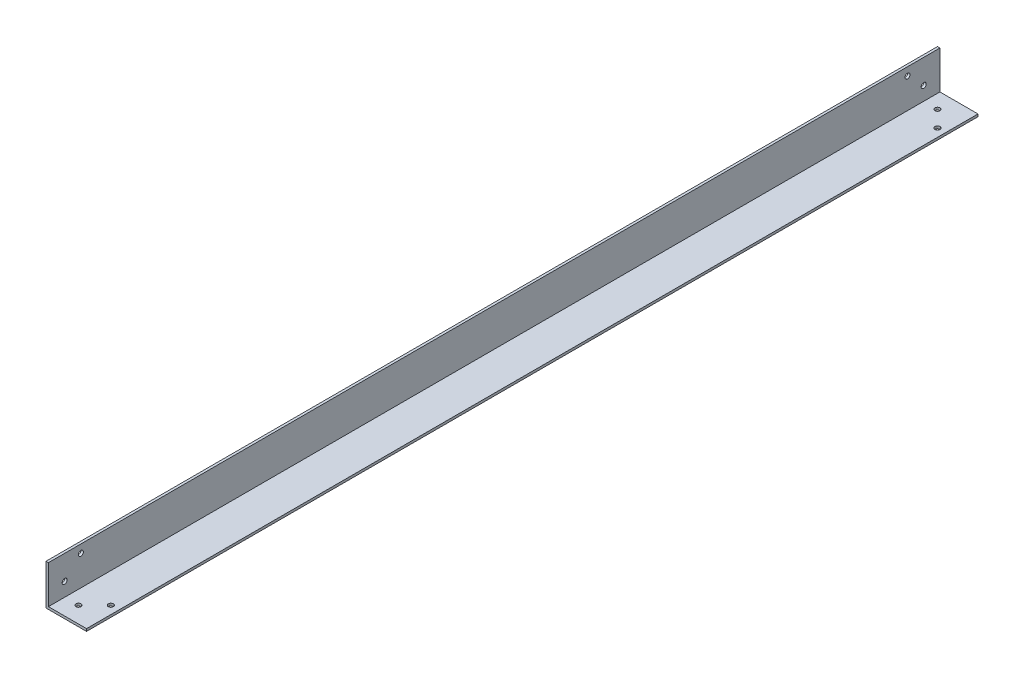
ISO-10303-21;
HEADER;
FILE_DESCRIPTION(('STEP AP214'),'2;1');
FILE_NAME('part.step','',(''),(''),'','','');
FILE_SCHEMA(('AUTOMOTIVE_DESIGN { 1 0 10303 214 1 1 1 1 }'));
ENDSEC;
DATA;
#1=APPLICATION_CONTEXT('core data for automotive mechanical design processes');
#2=APPLICATION_PROTOCOL_DEFINITION('international standard','automotive_design',2000,#1);
#3=PRODUCT_CONTEXT('',#1,'mechanical');
#4=PRODUCT('Part','Part','',(#3));
#5=PRODUCT_RELATED_PRODUCT_CATEGORY('part','',(#4));
#6=PRODUCT_DEFINITION_FORMATION('','',#4);
#7=PRODUCT_DEFINITION_CONTEXT('part definition',#1,'design');
#8=PRODUCT_DEFINITION('design','',#6,#7);
#9=PRODUCT_DEFINITION_SHAPE('','',#8);
#10=(LENGTH_UNIT() NAMED_UNIT(*) SI_UNIT(.MILLI.,.METRE.));
#11=(NAMED_UNIT(*) PLANE_ANGLE_UNIT() SI_UNIT($,.RADIAN.));
#12=(NAMED_UNIT(*) SI_UNIT($,.STERADIAN.) SOLID_ANGLE_UNIT());
#13=UNCERTAINTY_MEASURE_WITH_UNIT(LENGTH_MEASURE(1.E-05),#10,'distance_accuracy_value','');
#14=(GEOMETRIC_REPRESENTATION_CONTEXT(3) GLOBAL_UNCERTAINTY_ASSIGNED_CONTEXT((#13)) GLOBAL_UNIT_ASSIGNED_CONTEXT((#10,
#11,#12)) REPRESENTATION_CONTEXT('',''));
#15=CARTESIAN_POINT('',(0.,0.,0.));
#16=DIRECTION('',(0.,0.,1.));
#17=DIRECTION('',(1.,0.,0.));
#18=AXIS2_PLACEMENT_3D('',#15,#16,#17);
#19=CARTESIAN_POINT('',(25.,0.,550.));
#20=DIRECTION('',(0.,1.,0.));
#21=DIRECTION('',(-1.,0.,0.));
#22=AXIS2_PLACEMENT_3D('',#19,#20,#21);
#23=PLANE('',#22);
#24=CARTESIAN_POINT('',(10.,0.,10.));
#25=DIRECTION('',(0.,-1.,0.));
#26=DIRECTION('',(1.,0.,0.));
#27=AXIS2_PLACEMENT_3D('',#24,#25,#26);
#28=CIRCLE('',#27,1.55);
#29=CARTESIAN_POINT('',(11.55,0.,10.));
#30=VERTEX_POINT('',#29);
#31=EDGE_CURVE('E156',#30,#30,#28,.T.);
#32=ORIENTED_EDGE('',*,*,#31,.F.);
#33=EDGE_LOOP('',(#32));
#34=FACE_BOUND('',#33,.T.);
#35=CARTESIAN_POINT('',(20.0000000000001,0.,20.));
#36=DIRECTION('',(0.,-1.,0.));
#37=DIRECTION('',(1.,0.,0.));
#38=AXIS2_PLACEMENT_3D('',#35,#36,#37);
#39=CIRCLE('',#38,1.55);
#40=CARTESIAN_POINT('',(21.5500000000001,0.,20.));
#41=VERTEX_POINT('',#40);
#42=EDGE_CURVE('E146',#41,#41,#39,.T.);
#43=ORIENTED_EDGE('',*,*,#42,.F.);
#44=EDGE_LOOP('',(#43));
#45=FACE_BOUND('',#44,.T.);
#46=CARTESIAN_POINT('',(20.,0.,530.));
#47=DIRECTION('',(0.,-1.,0.));
#48=DIRECTION('',(1.,0.,0.));
#49=AXIS2_PLACEMENT_3D('',#46,#47,#48);
#50=CIRCLE('',#49,1.54999999999998);
#51=CARTESIAN_POINT('',(21.55,0.,530.));
#52=VERTEX_POINT('',#51);
#53=EDGE_CURVE('E143',#52,#52,#50,.T.);
#54=ORIENTED_EDGE('',*,*,#53,.F.);
#55=EDGE_LOOP('',(#54));
#56=FACE_BOUND('',#55,.T.);
#57=CARTESIAN_POINT('',(10.,0.,540.));
#58=DIRECTION('',(0.,-1.,0.));
#59=DIRECTION('',(1.,0.,0.));
#60=AXIS2_PLACEMENT_3D('',#57,#58,#59);
#61=CIRCLE('',#60,1.54999999999997);
#62=CARTESIAN_POINT('',(11.55,0.,540.));
#63=VERTEX_POINT('',#62);
#64=EDGE_CURVE('E140',#63,#63,#61,.T.);
#65=ORIENTED_EDGE('',*,*,#64,.F.);
#66=EDGE_LOOP('',(#65));
#67=FACE_BOUND('',#66,.T.);
#68=DIRECTION('',(1.,0.,0.));
#69=VECTOR('',#68,1.);
#70=CARTESIAN_POINT('',(25.,0.,0.));
#71=LINE('',#70,#69);
#72=CARTESIAN_POINT('',(0.,0.,0.));
#73=VERTEX_POINT('',#72);
#74=CARTESIAN_POINT('',(25.,0.,0.));
#75=VERTEX_POINT('',#74);
#76=EDGE_CURVE('E119',#73,#75,#71,.T.);
#77=ORIENTED_EDGE('',*,*,#76,.T.);
#78=DIRECTION('',(0.,0.,-1.));
#79=VECTOR('',#78,1.);
#80=CARTESIAN_POINT('',(25.,0.,550.));
#81=LINE('',#80,#79);
#82=CARTESIAN_POINT('',(25.,0.,550.));
#83=VERTEX_POINT('',#82);
#84=EDGE_CURVE('E11',#83,#75,#81,.T.);
#85=ORIENTED_EDGE('',*,*,#84,.F.);
#86=DIRECTION('',(1.,0.,0.));
#87=VECTOR('',#86,1.);
#88=CARTESIAN_POINT('',(25.,0.,550.));
#89=LINE('',#88,#87);
#90=CARTESIAN_POINT('',(0.,0.,550.));
#91=VERTEX_POINT('',#90);
#92=EDGE_CURVE('E130',#91,#83,#89,.T.);
#93=ORIENTED_EDGE('',*,*,#92,.F.);
#94=DIRECTION('',(0.,0.,-1.));
#95=VECTOR('',#94,1.);
#96=CARTESIAN_POINT('',(0.,0.,550.));
#97=LINE('',#96,#95);
#98=EDGE_CURVE('E115',#91,#73,#97,.T.);
#99=ORIENTED_EDGE('',*,*,#98,.T.);
#100=EDGE_LOOP('',(#77,#85,#93,#99));
#101=FACE_BOUND('',#100,.T.);
#102=ADVANCED_FACE('F33',(#34,#45,#56,#67,#101),#23,.F.);
#103=CARTESIAN_POINT('',(25.,1.5,550.));
#104=DIRECTION('',(-1.,0.,0.));
#105=DIRECTION('',(0.,0.,1.));
#106=AXIS2_PLACEMENT_3D('',#103,#104,#105);
#107=PLANE('',#106);
#108=DIRECTION('',(0.,1.,0.));
#109=VECTOR('',#108,1.);
#110=CARTESIAN_POINT('',(25.,1.5,0.));
#111=LINE('',#110,#109);
#112=CARTESIAN_POINT('',(25.,1.5,0.));
#113=VERTEX_POINT('',#112);
#114=EDGE_CURVE('E122',#75,#113,#111,.T.);
#115=ORIENTED_EDGE('',*,*,#114,.T.);
#116=DIRECTION('',(0.,0.,-1.));
#117=VECTOR('',#116,1.);
#118=CARTESIAN_POINT('',(25.,1.5,550.));
#119=LINE('',#118,#117);
#120=CARTESIAN_POINT('',(25.,1.5,550.));
#121=VERTEX_POINT('',#120);
#122=EDGE_CURVE('E42',#121,#113,#119,.T.);
#123=ORIENTED_EDGE('',*,*,#122,.F.);
#124=DIRECTION('',(0.,1.,0.));
#125=VECTOR('',#124,1.);
#126=CARTESIAN_POINT('',(25.,1.5,550.));
#127=LINE('',#126,#125);
#128=EDGE_CURVE('E88',#83,#121,#127,.T.);
#129=ORIENTED_EDGE('',*,*,#128,.F.);
#130=ORIENTED_EDGE('',*,*,#84,.T.);
#131=EDGE_LOOP('',(#115,#123,#129,#130));
#132=FACE_BOUND('',#131,.T.);
#133=ADVANCED_FACE('F186',(#132),#107,.F.);
#134=CARTESIAN_POINT('',(1.5,1.5,550.));
#135=DIRECTION('',(0.,-1.,0.));
#136=DIRECTION('',(1.,0.,0.));
#137=AXIS2_PLACEMENT_3D('',#134,#135,#136);
#138=PLANE('',#137);
#139=CARTESIAN_POINT('',(10.,1.5,10.));
#140=DIRECTION('',(0.,-1.,0.));
#141=DIRECTION('',(1.,0.,0.));
#142=AXIS2_PLACEMENT_3D('',#139,#140,#141);
#143=CIRCLE('',#142,1.55);
#144=CARTESIAN_POINT('',(11.55,1.5,10.));
#145=VERTEX_POINT('',#144);
#146=EDGE_CURVE('E36',#145,#145,#143,.T.);
#147=ORIENTED_EDGE('',*,*,#146,.T.);
#148=EDGE_LOOP('',(#147));
#149=FACE_BOUND('',#148,.T.);
#150=CARTESIAN_POINT('',(20.0000000000001,1.5,20.));
#151=DIRECTION('',(0.,-1.,0.));
#152=DIRECTION('',(1.,0.,0.));
#153=AXIS2_PLACEMENT_3D('',#150,#151,#152);
#154=CIRCLE('',#153,1.55);
#155=CARTESIAN_POINT('',(21.5500000000001,1.5,20.));
#156=VERTEX_POINT('',#155);
#157=EDGE_CURVE('E144',#156,#156,#154,.T.);
#158=ORIENTED_EDGE('',*,*,#157,.T.);
#159=EDGE_LOOP('',(#158));
#160=FACE_BOUND('',#159,.T.);
#161=CARTESIAN_POINT('',(20.,1.5,530.));
#162=DIRECTION('',(0.,-1.,0.));
#163=DIRECTION('',(1.,0.,0.));
#164=AXIS2_PLACEMENT_3D('',#161,#162,#163);
#165=CIRCLE('',#164,1.54999999999998);
#166=CARTESIAN_POINT('',(21.55,1.5,530.));
#167=VERTEX_POINT('',#166);
#168=EDGE_CURVE('E141',#167,#167,#165,.T.);
#169=ORIENTED_EDGE('',*,*,#168,.T.);
#170=EDGE_LOOP('',(#169));
#171=FACE_BOUND('',#170,.T.);
#172=CARTESIAN_POINT('',(10.,1.5,540.));
#173=DIRECTION('',(0.,-1.,0.));
#174=DIRECTION('',(1.,0.,0.));
#175=AXIS2_PLACEMENT_3D('',#172,#173,#174);
#176=CIRCLE('',#175,1.54999999999997);
#177=CARTESIAN_POINT('',(11.55,1.5,540.));
#178=VERTEX_POINT('',#177);
#179=EDGE_CURVE('E136',#178,#178,#176,.T.);
#180=ORIENTED_EDGE('',*,*,#179,.T.);
#181=EDGE_LOOP('',(#180));
#182=FACE_BOUND('',#181,.T.);
#183=DIRECTION('',(-1.,0.,0.));
#184=VECTOR('',#183,1.);
#185=CARTESIAN_POINT('',(1.5,1.5,0.));
#186=LINE('',#185,#184);
#187=CARTESIAN_POINT('',(1.5,1.5,0.));
#188=VERTEX_POINT('',#187);
#189=EDGE_CURVE('E125',#113,#188,#186,.T.);
#190=ORIENTED_EDGE('',*,*,#189,.T.);
#191=DIRECTION('',(0.,0.,-1.));
#192=VECTOR('',#191,1.);
#193=CARTESIAN_POINT('',(1.5,1.5,550.));
#194=LINE('',#193,#192);
#195=CARTESIAN_POINT('',(1.5,1.5,550.));
#196=VERTEX_POINT('',#195);
#197=EDGE_CURVE('E110',#196,#188,#194,.T.);
#198=ORIENTED_EDGE('',*,*,#197,.F.);
#199=DIRECTION('',(-1.,0.,0.));
#200=VECTOR('',#199,1.);
#201=CARTESIAN_POINT('',(1.5,1.5,550.));
#202=LINE('',#201,#200);
#203=EDGE_CURVE('E101',#121,#196,#202,.T.);
#204=ORIENTED_EDGE('',*,*,#203,.F.);
#205=ORIENTED_EDGE('',*,*,#122,.T.);
#206=EDGE_LOOP('',(#190,#198,#204,#205));
#207=FACE_BOUND('',#206,.T.);
#208=ADVANCED_FACE('F189',(#149,#160,#171,#182,#207),#138,.F.);
#209=CARTESIAN_POINT('',(1.5,25.,550.));
#210=DIRECTION('',(-1.,0.,0.));
#211=DIRECTION('',(0.,-1.,0.));
#212=AXIS2_PLACEMENT_3D('',#209,#210,#211);
#213=PLANE('',#212);
#214=CARTESIAN_POINT('',(1.5,10.,540.));
#215=DIRECTION('',(-1.,0.,0.));
#216=DIRECTION('',(0.,-1.,0.));
#217=AXIS2_PLACEMENT_3D('',#214,#215,#216);
#218=CIRCLE('',#217,1.55);
#219=CARTESIAN_POINT('',(1.5,8.45,540.));
#220=VERTEX_POINT('',#219);
#221=EDGE_CURVE('E163',#220,#220,#218,.T.);
#222=ORIENTED_EDGE('',*,*,#221,.T.);
#223=EDGE_LOOP('',(#222));
#224=FACE_BOUND('',#223,.T.);
#225=CARTESIAN_POINT('',(1.5,20.,530.));
#226=DIRECTION('',(-1.,0.,0.));
#227=DIRECTION('',(0.,-1.,0.));
#228=AXIS2_PLACEMENT_3D('',#225,#226,#227);
#229=CIRCLE('',#228,1.55);
#230=CARTESIAN_POINT('',(1.5,18.45,530.));
#231=VERTEX_POINT('',#230);
#232=EDGE_CURVE('E169',#231,#231,#229,.T.);
#233=ORIENTED_EDGE('',*,*,#232,.T.);
#234=EDGE_LOOP('',(#233));
#235=FACE_BOUND('',#234,.T.);
#236=CARTESIAN_POINT('',(1.5,20.,20.));
#237=DIRECTION('',(-1.,0.,0.));
#238=DIRECTION('',(0.,-1.,0.));
#239=AXIS2_PLACEMENT_3D('',#236,#237,#238);
#240=CIRCLE('',#239,1.55);
#241=CARTESIAN_POINT('',(1.5,18.45,20.));
#242=VERTEX_POINT('',#241);
#243=EDGE_CURVE('E175',#242,#242,#240,.T.);
#244=ORIENTED_EDGE('',*,*,#243,.T.);
#245=EDGE_LOOP('',(#244));
#246=FACE_BOUND('',#245,.T.);
#247=CARTESIAN_POINT('',(1.5,10.,10.));
#248=DIRECTION('',(-1.,0.,0.));
#249=DIRECTION('',(0.,-1.,0.));
#250=AXIS2_PLACEMENT_3D('',#247,#248,#249);
#251=CIRCLE('',#250,1.55);
#252=CARTESIAN_POINT('',(1.5,8.45,10.));
#253=VERTEX_POINT('',#252);
#254=EDGE_CURVE('E123',#253,#253,#251,.T.);
#255=ORIENTED_EDGE('',*,*,#254,.T.);
#256=EDGE_LOOP('',(#255));
#257=FACE_BOUND('',#256,.T.);
#258=DIRECTION('',(0.,1.,0.));
#259=VECTOR('',#258,1.);
#260=CARTESIAN_POINT('',(1.5,25.,0.));
#261=LINE('',#260,#259);
#262=CARTESIAN_POINT('',(1.5,25.,0.));
#263=VERTEX_POINT('',#262);
#264=EDGE_CURVE('E109',#188,#263,#261,.T.);
#265=ORIENTED_EDGE('',*,*,#264,.T.);
#266=DIRECTION('',(0.,0.,-1.));
#267=VECTOR('',#266,1.);
#268=CARTESIAN_POINT('',(1.5,25.,550.));
#269=LINE('',#268,#267);
#270=CARTESIAN_POINT('',(1.5,25.,550.));
#271=VERTEX_POINT('',#270);
#272=EDGE_CURVE('E106',#271,#263,#269,.T.);
#273=ORIENTED_EDGE('',*,*,#272,.F.);
#274=DIRECTION('',(0.,1.,0.));
#275=VECTOR('',#274,1.);
#276=CARTESIAN_POINT('',(1.5,25.,550.));
#277=LINE('',#276,#275);
#278=EDGE_CURVE('E95',#196,#271,#277,.T.);
#279=ORIENTED_EDGE('',*,*,#278,.F.);
#280=ORIENTED_EDGE('',*,*,#197,.T.);
#281=EDGE_LOOP('',(#265,#273,#279,#280));
#282=FACE_BOUND('',#281,.T.);
#283=ADVANCED_FACE('F107',(#224,#235,#246,#257,#282),#213,.F.);
#284=CARTESIAN_POINT('',(0.,25.,550.));
#285=DIRECTION('',(0.,-1.,0.));
#286=DIRECTION('',(0.,0.,-1.));
#287=AXIS2_PLACEMENT_3D('',#284,#285,#286);
#288=PLANE('',#287);
#289=DIRECTION('',(-1.,0.,0.));
#290=VECTOR('',#289,1.);
#291=CARTESIAN_POINT('',(0.,25.,0.));
#292=LINE('',#291,#290);
#293=CARTESIAN_POINT('',(0.,25.,0.));
#294=VERTEX_POINT('',#293);
#295=EDGE_CURVE('E74',#263,#294,#292,.T.);
#296=ORIENTED_EDGE('',*,*,#295,.T.);
#297=DIRECTION('',(0.,0.,-1.));
#298=VECTOR('',#297,1.);
#299=CARTESIAN_POINT('',(0.,25.,550.));
#300=LINE('',#299,#298);
#301=CARTESIAN_POINT('',(0.,25.,550.));
#302=VERTEX_POINT('',#301);
#303=EDGE_CURVE('E111',#302,#294,#300,.T.);
#304=ORIENTED_EDGE('',*,*,#303,.F.);
#305=DIRECTION('',(-1.,0.,0.));
#306=VECTOR('',#305,1.);
#307=CARTESIAN_POINT('',(0.,25.,550.));
#308=LINE('',#307,#306);
#309=EDGE_CURVE('E99',#271,#302,#308,.T.);
#310=ORIENTED_EDGE('',*,*,#309,.F.);
#311=ORIENTED_EDGE('',*,*,#272,.T.);
#312=EDGE_LOOP('',(#296,#304,#310,#311));
#313=FACE_BOUND('',#312,.T.);
#314=ADVANCED_FACE('F113',(#313),#288,.F.);
#315=CARTESIAN_POINT('',(0.,0.,550.));
#316=DIRECTION('',(1.,0.,0.));
#317=DIRECTION('',(0.,0.,-1.));
#318=AXIS2_PLACEMENT_3D('',#315,#316,#317);
#319=PLANE('',#318);
#320=CARTESIAN_POINT('',(0.,10.,540.));
#321=DIRECTION('',(-1.,0.,0.));
#322=DIRECTION('',(0.,0.,1.));
#323=AXIS2_PLACEMENT_3D('',#320,#321,#322);
#324=CIRCLE('',#323,1.55);
#325=CARTESIAN_POINT('',(0.,10.,541.55));
#326=VERTEX_POINT('',#325);
#327=EDGE_CURVE('E139',#326,#326,#324,.T.);
#328=ORIENTED_EDGE('',*,*,#327,.F.);
#329=EDGE_LOOP('',(#328));
#330=FACE_BOUND('',#329,.T.);
#331=CARTESIAN_POINT('',(0.,20.,530.));
#332=DIRECTION('',(-1.,0.,0.));
#333=DIRECTION('',(0.,0.,1.));
#334=AXIS2_PLACEMENT_3D('',#331,#332,#333);
#335=CIRCLE('',#334,1.55);
#336=CARTESIAN_POINT('',(0.,20.,531.55));
#337=VERTEX_POINT('',#336);
#338=EDGE_CURVE('E166',#337,#337,#335,.T.);
#339=ORIENTED_EDGE('',*,*,#338,.F.);
#340=EDGE_LOOP('',(#339));
#341=FACE_BOUND('',#340,.T.);
#342=CARTESIAN_POINT('',(0.,20.,20.));
#343=DIRECTION('',(-1.,0.,0.));
#344=DIRECTION('',(0.,0.,1.));
#345=AXIS2_PLACEMENT_3D('',#342,#343,#344);
#346=CIRCLE('',#345,1.55);
#347=CARTESIAN_POINT('',(0.,20.,21.55));
#348=VERTEX_POINT('',#347);
#349=EDGE_CURVE('E172',#348,#348,#346,.T.);
#350=ORIENTED_EDGE('',*,*,#349,.F.);
#351=EDGE_LOOP('',(#350));
#352=FACE_BOUND('',#351,.T.);
#353=CARTESIAN_POINT('',(0.,10.,10.));
#354=DIRECTION('',(-1.,0.,0.));
#355=DIRECTION('',(0.,0.,1.));
#356=AXIS2_PLACEMENT_3D('',#353,#354,#355);
#357=CIRCLE('',#356,1.55);
#358=CARTESIAN_POINT('',(0.,10.,11.55));
#359=VERTEX_POINT('',#358);
#360=EDGE_CURVE('E178',#359,#359,#357,.T.);
#361=ORIENTED_EDGE('',*,*,#360,.F.);
#362=EDGE_LOOP('',(#361));
#363=FACE_BOUND('',#362,.T.);
#364=DIRECTION('',(0.,-1.,0.));
#365=VECTOR('',#364,1.);
#366=CARTESIAN_POINT('',(0.,0.,0.));
#367=LINE('',#366,#365);
#368=EDGE_CURVE('E80',#294,#73,#367,.T.);
#369=ORIENTED_EDGE('',*,*,#368,.T.);
#370=ORIENTED_EDGE('',*,*,#98,.F.);
#371=DIRECTION('',(0.,-1.,0.));
#372=VECTOR('',#371,1.);
#373=CARTESIAN_POINT('',(0.,0.,550.));
#374=LINE('',#373,#372);
#375=EDGE_CURVE('E51',#302,#91,#374,.T.);
#376=ORIENTED_EDGE('',*,*,#375,.F.);
#377=ORIENTED_EDGE('',*,*,#303,.T.);
#378=EDGE_LOOP('',(#369,#370,#376,#377));
#379=FACE_BOUND('',#378,.T.);
#380=ADVANCED_FACE('F194',(#330,#341,#352,#363,#379),#319,.F.);
#381=CARTESIAN_POINT('',(0.,0.,550.));
#382=DIRECTION('',(0.,0.,-1.));
#383=DIRECTION('',(-1.,0.,0.));
#384=AXIS2_PLACEMENT_3D('',#381,#382,#383);
#385=PLANE('',#384);
#386=ORIENTED_EDGE('',*,*,#92,.T.);
#387=ORIENTED_EDGE('',*,*,#128,.T.);
#388=ORIENTED_EDGE('',*,*,#203,.T.);
#389=ORIENTED_EDGE('',*,*,#278,.T.);
#390=ORIENTED_EDGE('',*,*,#309,.T.);
#391=ORIENTED_EDGE('',*,*,#375,.T.);
#392=EDGE_LOOP('',(#386,#387,#388,#389,#390,#391));
#393=FACE_BOUND('',#392,.T.);
#394=ADVANCED_FACE('F97',(#393),#385,.F.);
#395=CARTESIAN_POINT('',(0.,0.,0.));
#396=DIRECTION('',(0.,0.,-1.));
#397=DIRECTION('',(-1.,0.,0.));
#398=AXIS2_PLACEMENT_3D('',#395,#396,#397);
#399=PLANE('',#398);
#400=ORIENTED_EDGE('',*,*,#76,.F.);
#401=ORIENTED_EDGE('',*,*,#368,.F.);
#402=ORIENTED_EDGE('',*,*,#295,.F.);
#403=ORIENTED_EDGE('',*,*,#264,.F.);
#404=ORIENTED_EDGE('',*,*,#189,.F.);
#405=ORIENTED_EDGE('',*,*,#114,.F.);
#406=EDGE_LOOP('',(#400,#401,#402,#403,#404,#405));
#407=FACE_BOUND('',#406,.T.);
#408=ADVANCED_FACE('F192',(#407),#399,.T.);
#409=CARTESIAN_POINT('',(10.,10.,10.));
#410=DIRECTION('',(-1.,0.,0.));
#411=DIRECTION('',(0.,0.,1.));
#412=AXIS2_PLACEMENT_3D('',#409,#410,#411);
#413=CYLINDRICAL_SURFACE('',#412,1.55);
#414=ORIENTED_EDGE('',*,*,#360,.T.);
#415=EDGE_LOOP('',(#414));
#416=FACE_BOUND('',#415,.T.);
#417=ORIENTED_EDGE('',*,*,#254,.F.);
#418=EDGE_LOOP('',(#417));
#419=FACE_BOUND('',#418,.T.);
#420=ADVANCED_FACE('F264',(#416,#419),#413,.F.);
#421=CARTESIAN_POINT('',(10.,20.,20.));
#422=DIRECTION('',(-1.,0.,0.));
#423=DIRECTION('',(0.,0.,1.));
#424=AXIS2_PLACEMENT_3D('',#421,#422,#423);
#425=CYLINDRICAL_SURFACE('',#424,1.55);
#426=ORIENTED_EDGE('',*,*,#349,.T.);
#427=EDGE_LOOP('',(#426));
#428=FACE_BOUND('',#427,.T.);
#429=ORIENTED_EDGE('',*,*,#243,.F.);
#430=EDGE_LOOP('',(#429));
#431=FACE_BOUND('',#430,.T.);
#432=ADVANCED_FACE('F260',(#428,#431),#425,.F.);
#433=CARTESIAN_POINT('',(10.,20.,530.));
#434=DIRECTION('',(-1.,0.,0.));
#435=DIRECTION('',(0.,0.,1.));
#436=AXIS2_PLACEMENT_3D('',#433,#434,#435);
#437=CYLINDRICAL_SURFACE('',#436,1.55);
#438=ORIENTED_EDGE('',*,*,#338,.T.);
#439=EDGE_LOOP('',(#438));
#440=FACE_BOUND('',#439,.T.);
#441=ORIENTED_EDGE('',*,*,#232,.F.);
#442=EDGE_LOOP('',(#441));
#443=FACE_BOUND('',#442,.T.);
#444=ADVANCED_FACE('F256',(#440,#443),#437,.F.);
#445=CARTESIAN_POINT('',(10.,10.,540.));
#446=DIRECTION('',(-1.,0.,0.));
#447=DIRECTION('',(0.,0.,1.));
#448=AXIS2_PLACEMENT_3D('',#445,#446,#447);
#449=CYLINDRICAL_SURFACE('',#448,1.55);
#450=ORIENTED_EDGE('',*,*,#327,.T.);
#451=EDGE_LOOP('',(#450));
#452=FACE_BOUND('',#451,.T.);
#453=ORIENTED_EDGE('',*,*,#221,.F.);
#454=EDGE_LOOP('',(#453));
#455=FACE_BOUND('',#454,.T.);
#456=ADVANCED_FACE('F228',(#452,#455),#449,.F.);
#457=CARTESIAN_POINT('',(10.,10.,540.));
#458=DIRECTION('',(0.,-1.,0.));
#459=DIRECTION('',(1.,0.,0.));
#460=AXIS2_PLACEMENT_3D('',#457,#458,#459);
#461=CYLINDRICAL_SURFACE('',#460,1.54999999999997);
#462=ORIENTED_EDGE('',*,*,#64,.T.);
#463=EDGE_LOOP('',(#462));
#464=FACE_BOUND('',#463,.T.);
#465=ORIENTED_EDGE('',*,*,#179,.F.);
#466=EDGE_LOOP('',(#465));
#467=FACE_BOUND('',#466,.T.);
#468=ADVANCED_FACE('F224',(#464,#467),#461,.F.);
#469=CARTESIAN_POINT('',(20.,10.,530.));
#470=DIRECTION('',(0.,-1.,0.));
#471=DIRECTION('',(1.,0.,0.));
#472=AXIS2_PLACEMENT_3D('',#469,#470,#471);
#473=CYLINDRICAL_SURFACE('',#472,1.54999999999998);
#474=ORIENTED_EDGE('',*,*,#53,.T.);
#475=EDGE_LOOP('',(#474));
#476=FACE_BOUND('',#475,.T.);
#477=ORIENTED_EDGE('',*,*,#168,.F.);
#478=EDGE_LOOP('',(#477));
#479=FACE_BOUND('',#478,.T.);
#480=ADVANCED_FACE('F227',(#476,#479),#473,.F.);
#481=CARTESIAN_POINT('',(20.0000000000001,10.,20.));
#482=DIRECTION('',(0.,-1.,0.));
#483=DIRECTION('',(1.,0.,0.));
#484=AXIS2_PLACEMENT_3D('',#481,#482,#483);
#485=CYLINDRICAL_SURFACE('',#484,1.55);
#486=ORIENTED_EDGE('',*,*,#42,.T.);
#487=EDGE_LOOP('',(#486));
#488=FACE_BOUND('',#487,.T.);
#489=ORIENTED_EDGE('',*,*,#157,.F.);
#490=EDGE_LOOP('',(#489));
#491=FACE_BOUND('',#490,.T.);
#492=ADVANCED_FACE('F244',(#488,#491),#485,.F.);
#493=CARTESIAN_POINT('',(10.,10.,10.));
#494=DIRECTION('',(0.,-1.,0.));
#495=DIRECTION('',(1.,0.,0.));
#496=AXIS2_PLACEMENT_3D('',#493,#494,#495);
#497=CYLINDRICAL_SURFACE('',#496,1.55);
#498=ORIENTED_EDGE('',*,*,#31,.T.);
#499=EDGE_LOOP('',(#498));
#500=FACE_BOUND('',#499,.T.);
#501=ORIENTED_EDGE('',*,*,#146,.F.);
#502=EDGE_LOOP('',(#501));
#503=FACE_BOUND('',#502,.T.);
#504=ADVANCED_FACE('F250',(#500,#503),#497,.F.);
#505=CLOSED_SHELL('',(#102,#133,#208,#283,#314,#380,#394,#408,#420,#432,#444,#456,#468,#480,
#492,#504));
#506=MANIFOLD_SOLID_BREP('B2',#505);
#507=ADVANCED_BREP_SHAPE_REPRESENTATION('',(#18,#506),#14);
#508=SHAPE_DEFINITION_REPRESENTATION(#9,#507);
ENDSEC;
END-ISO-10303-21;
